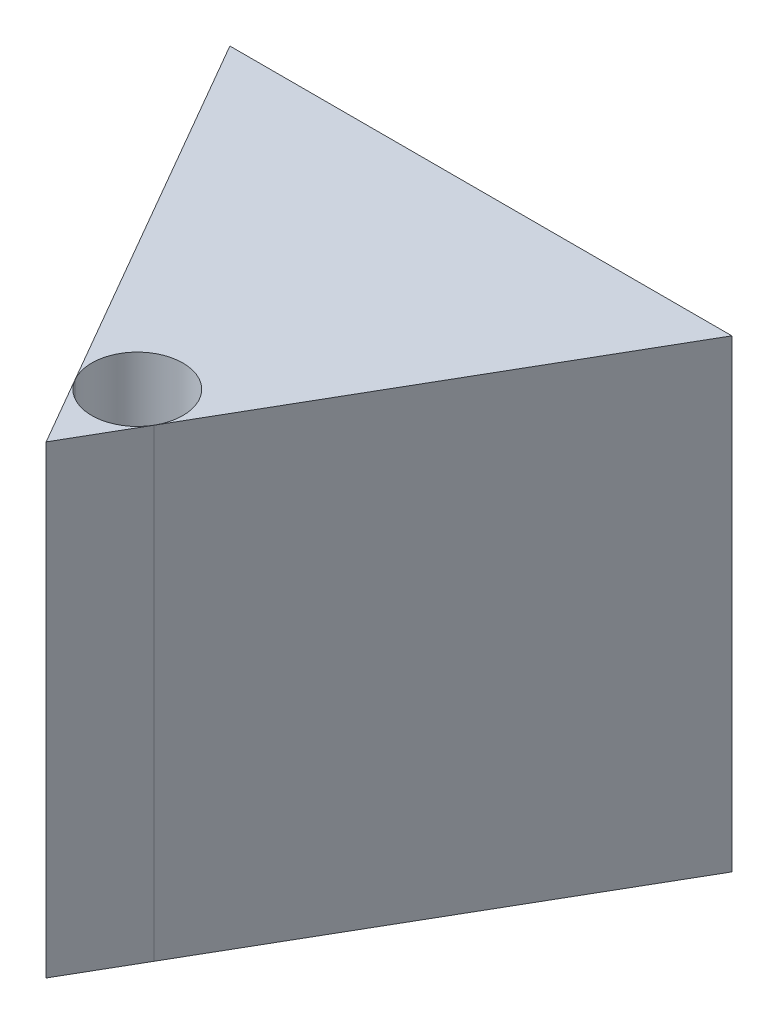
ISO-10303-21;
HEADER;
FILE_DESCRIPTION(('STEP AP214'),'2;1');
FILE_NAME('part.step','',(''),(''),'','','');
FILE_SCHEMA(('AUTOMOTIVE_DESIGN { 1 0 10303 214 1 1 1 1 }'));
ENDSEC;
DATA;
#1=APPLICATION_CONTEXT('core data for automotive mechanical design processes');
#2=APPLICATION_PROTOCOL_DEFINITION('international standard','automotive_design',2000,#1);
#3=PRODUCT_CONTEXT('',#1,'mechanical');
#4=PRODUCT('Part','Part','',(#3));
#5=PRODUCT_RELATED_PRODUCT_CATEGORY('part','',(#4));
#6=PRODUCT_DEFINITION_FORMATION('','',#4);
#7=PRODUCT_DEFINITION_CONTEXT('part definition',#1,'design');
#8=PRODUCT_DEFINITION('design','',#6,#7);
#9=PRODUCT_DEFINITION_SHAPE('','',#8);
#10=(LENGTH_UNIT() NAMED_UNIT(*) SI_UNIT(.MILLI.,.METRE.));
#11=(NAMED_UNIT(*) PLANE_ANGLE_UNIT() SI_UNIT($,.RADIAN.));
#12=(NAMED_UNIT(*) SI_UNIT($,.STERADIAN.) SOLID_ANGLE_UNIT());
#13=UNCERTAINTY_MEASURE_WITH_UNIT(LENGTH_MEASURE(1.E-05),#10,'distance_accuracy_value','');
#14=(GEOMETRIC_REPRESENTATION_CONTEXT(3) GLOBAL_UNCERTAINTY_ASSIGNED_CONTEXT((#13)) GLOBAL_UNIT_ASSIGNED_CONTEXT((#10,
#11,#12)) REPRESENTATION_CONTEXT('',''));
#15=CARTESIAN_POINT('',(0.,0.,0.));
#16=DIRECTION('',(0.,0.,1.));
#17=DIRECTION('',(1.,0.,0.));
#18=AXIS2_PLACEMENT_3D('',#15,#16,#17);
#19=CARTESIAN_POINT('',(-81.0882561747552,200.,46.8163265306122));
#20=DIRECTION('',(-0.866025403784439,0.,0.5));
#21=DIRECTION('',(0.5,0.,0.866025403784439));
#22=AXIS2_PLACEMENT_3D('',#19,#20,#21);
#23=PLANE('',#22);
#24=DIRECTION('',(-0.5,0.,-0.866025403784439));
#25=VECTOR('',#24,1.);
#26=CARTESIAN_POINT('',(-81.0882561747552,0.,46.8163265306122));
#27=LINE('',#26,#25);
#28=CARTESIAN_POINT('',(0.,0.,187.265306122449));
#29=VERTEX_POINT('',#28);
#30=CARTESIAN_POINT('',(-17.0023762947068,0.,157.816326530612));
#31=VERTEX_POINT('',#30);
#32=EDGE_CURVE('E85',#29,#31,#27,.T.);
#33=ORIENTED_EDGE('',*,*,#32,.F.);
#34=DIRECTION('',(0.,-1.,0.));
#35=VECTOR('',#34,1.);
#36=CARTESIAN_POINT('',(0.,200.,187.265306122449));
#37=LINE('',#36,#35);
#38=CARTESIAN_POINT('',(0.,200.,187.265306122449));
#39=VERTEX_POINT('',#38);
#40=EDGE_CURVE('E12',#39,#29,#37,.T.);
#41=ORIENTED_EDGE('',*,*,#40,.F.);
#42=DIRECTION('',(-0.5,0.,-0.866025403784439));
#43=VECTOR('',#42,1.);
#44=CARTESIAN_POINT('',(-81.0882561747552,200.,46.8163265306122));
#45=LINE('',#44,#43);
#46=CARTESIAN_POINT('',(-17.0023762947068,200.,157.816326530612));
#47=VERTEX_POINT('',#46);
#48=EDGE_CURVE('E83',#39,#47,#45,.T.);
#49=ORIENTED_EDGE('',*,*,#48,.T.);
#50=DIRECTION('',(0.,-1.,0.));
#51=VECTOR('',#50,1.);
#52=CARTESIAN_POINT('',(-17.0023762947068,200.,157.816326530612));
#53=LINE('',#52,#51);
#54=EDGE_CURVE('E67',#47,#31,#53,.T.);
#55=ORIENTED_EDGE('',*,*,#54,.T.);
#56=EDGE_LOOP('',(#33,#41,#49,#55));
#57=FACE_BOUND('',#56,.T.);
#58=ADVANCED_FACE('F51',(#57),#23,.T.);
#59=CARTESIAN_POINT('',(81.0882561747552,200.,46.8163265306123));
#60=DIRECTION('',(0.866025403784439,0.,0.5));
#61=DIRECTION('',(0.5,0.,-0.866025403784439));
#62=AXIS2_PLACEMENT_3D('',#59,#60,#61);
#63=PLANE('',#62);
#64=DIRECTION('',(-0.5,0.,0.866025403784439));
#65=VECTOR('',#64,1.);
#66=CARTESIAN_POINT('',(81.0882561747552,0.,46.8163265306123));
#67=LINE('',#66,#65);
#68=CARTESIAN_POINT('',(17.0023762947068,0.,157.816326530612));
#69=VERTEX_POINT('',#68);
#70=EDGE_CURVE('E101',#69,#29,#67,.T.);
#71=ORIENTED_EDGE('',*,*,#70,.F.);
#72=DIRECTION('',(0.,-1.,0.));
#73=VECTOR('',#72,1.);
#74=CARTESIAN_POINT('',(17.0023762947068,200.,157.816326530612));
#75=LINE('',#74,#73);
#76=CARTESIAN_POINT('',(17.0023762947068,200.,157.816326530612));
#77=VERTEX_POINT('',#76);
#78=EDGE_CURVE('E59',#77,#69,#75,.T.);
#79=ORIENTED_EDGE('',*,*,#78,.F.);
#80=DIRECTION('',(-0.5,0.,0.866025403784439));
#81=VECTOR('',#80,1.);
#82=CARTESIAN_POINT('',(81.0882561747552,200.,46.8163265306123));
#83=LINE('',#82,#81);
#84=EDGE_CURVE('E92',#77,#39,#83,.T.);
#85=ORIENTED_EDGE('',*,*,#84,.T.);
#86=ORIENTED_EDGE('',*,*,#40,.T.);
#87=EDGE_LOOP('',(#71,#79,#85,#86));
#88=FACE_BOUND('',#87,.T.);
#89=ADVANCED_FACE('F96',(#88),#63,.T.);
#90=CARTESIAN_POINT('',(0.,200.,148.));
#91=DIRECTION('',(0.,-1.,0.));
#92=DIRECTION('',(0.,0.,-1.));
#93=AXIS2_PLACEMENT_3D('',#90,#91,#92);
#94=CYLINDRICAL_SURFACE('',#93,19.6326530612245);
#95=CARTESIAN_POINT('',(0.,0.,148.));
#96=DIRECTION('',(0.,1.,0.));
#97=DIRECTION('',(0.,0.,1.));
#98=AXIS2_PLACEMENT_3D('',#95,#96,#97);
#99=CIRCLE('',#98,19.6326530612245);
#100=EDGE_CURVE('E94',#31,#69,#99,.T.);
#101=ORIENTED_EDGE('',*,*,#100,.F.);
#102=ORIENTED_EDGE('',*,*,#54,.F.);
#103=CARTESIAN_POINT('',(0.,200.,148.));
#104=DIRECTION('',(0.,1.,0.));
#105=DIRECTION('',(0.,0.,1.));
#106=AXIS2_PLACEMENT_3D('',#103,#104,#105);
#107=CIRCLE('',#106,19.6326530612245);
#108=EDGE_CURVE('E93',#47,#77,#107,.T.);
#109=ORIENTED_EDGE('',*,*,#108,.T.);
#110=ORIENTED_EDGE('',*,*,#78,.T.);
#111=EDGE_LOOP('',(#101,#102,#109,#110));
#112=FACE_BOUND('',#111,.T.);
#113=ADVANCED_FACE('F107',(#112),#94,.F.);
#114=CARTESIAN_POINT('',(0.,200.,0.));
#115=DIRECTION('',(0.,1.,0.));
#116=DIRECTION('',(0.,0.,1.));
#117=AXIS2_PLACEMENT_3D('',#114,#115,#116);
#118=PLANE('',#117);
#119=ORIENTED_EDGE('',*,*,#48,.F.);
#120=ORIENTED_EDGE('',*,*,#84,.F.);
#121=ORIENTED_EDGE('',*,*,#108,.F.);
#122=EDGE_LOOP('',(#119,#120,#121));
#123=FACE_BOUND('',#122,.T.);
#124=ADVANCED_FACE('F91',(#123),#118,.T.);
#125=CARTESIAN_POINT('',(0.,0.,0.));
#126=DIRECTION('',(0.,1.,0.));
#127=DIRECTION('',(0.,0.,1.));
#128=AXIS2_PLACEMENT_3D('',#125,#126,#127);
#129=PLANE('',#128);
#130=ORIENTED_EDGE('',*,*,#32,.T.);
#131=ORIENTED_EDGE('',*,*,#100,.T.);
#132=ORIENTED_EDGE('',*,*,#70,.T.);
#133=EDGE_LOOP('',(#130,#131,#132));
#134=FACE_BOUND('',#133,.T.);
#135=ADVANCED_FACE('F106',(#134),#129,.F.);
#136=CLOSED_SHELL('',(#58,#89,#113,#124,#135));
#137=MANIFOLD_SOLID_BREP('B2',#136);
#138=CARTESIAN_POINT('',(0.,200.,0.));
#139=DIRECTION('',(0.,0.,-1.));
#140=DIRECTION('',(-1.,0.,0.));
#141=AXIS2_PLACEMENT_3D('',#138,#139,#140);
#142=PLANE('',#141);
#143=DIRECTION('',(1.,0.,0.));
#144=VECTOR('',#143,1.);
#145=CARTESIAN_POINT('',(0.,0.,0.));
#146=LINE('',#145,#144);
#147=CARTESIAN_POINT('',(-108.117674899674,0.,0.));
#148=VERTEX_POINT('',#147);
#149=CARTESIAN_POINT('',(108.117674899674,0.,0.));
#150=VERTEX_POINT('',#149);
#151=EDGE_CURVE('E223',#148,#150,#146,.T.);
#152=ORIENTED_EDGE('',*,*,#151,.F.);
#153=DIRECTION('',(0.,-1.,0.));
#154=VECTOR('',#153,1.);
#155=CARTESIAN_POINT('',(-108.117674899674,200.,0.));
#156=LINE('',#155,#154);
#157=CARTESIAN_POINT('',(-108.117674899674,200.,0.));
#158=VERTEX_POINT('',#157);
#159=EDGE_CURVE('E49',#158,#148,#156,.T.);
#160=ORIENTED_EDGE('',*,*,#159,.F.);
#161=DIRECTION('',(1.,0.,0.));
#162=VECTOR('',#161,1.);
#163=CARTESIAN_POINT('',(0.,200.,0.));
#164=LINE('',#163,#162);
#165=CARTESIAN_POINT('',(108.117674899674,200.,0.));
#166=VERTEX_POINT('',#165);
#167=EDGE_CURVE('E212',#158,#166,#164,.T.);
#168=ORIENTED_EDGE('',*,*,#167,.T.);
#169=DIRECTION('',(0.,-1.,0.));
#170=VECTOR('',#169,1.);
#171=CARTESIAN_POINT('',(108.117674899674,200.,0.));
#172=LINE('',#171,#170);
#173=EDGE_CURVE('E172',#166,#150,#172,.T.);
#174=ORIENTED_EDGE('',*,*,#173,.T.);
#175=EDGE_LOOP('',(#152,#160,#168,#174));
#176=FACE_BOUND('',#175,.T.);
#177=ADVANCED_FACE('F155',(#176),#142,.T.);
#178=CARTESIAN_POINT('',(-81.0882561747552,200.,46.8163265306122));
#179=DIRECTION('',(-0.866025403784439,0.,0.5));
#180=DIRECTION('',(0.5,0.,0.866025403784439));
#181=AXIS2_PLACEMENT_3D('',#178,#179,#180);
#182=PLANE('',#181);
#183=DIRECTION('',(-0.5,0.,-0.866025403784439));
#184=VECTOR('',#183,1.);
#185=CARTESIAN_POINT('',(-81.0882561747552,0.,46.8163265306122));
#186=LINE('',#185,#184);
#187=CARTESIAN_POINT('',(-17.0023762947068,0.,157.816326530612));
#188=VERTEX_POINT('',#187);
#189=EDGE_CURVE('E202',#188,#148,#186,.T.);
#190=ORIENTED_EDGE('',*,*,#189,.F.);
#191=DIRECTION('',(0.,-1.,0.));
#192=VECTOR('',#191,1.);
#193=CARTESIAN_POINT('',(-17.0023762947068,200.,157.816326530612));
#194=LINE('',#193,#192);
#195=CARTESIAN_POINT('',(-17.0023762947068,200.,157.816326530612));
#196=VERTEX_POINT('',#195);
#197=EDGE_CURVE('E164',#196,#188,#194,.T.);
#198=ORIENTED_EDGE('',*,*,#197,.F.);
#199=DIRECTION('',(-0.5,0.,-0.866025403784439));
#200=VECTOR('',#199,1.);
#201=CARTESIAN_POINT('',(-81.0882561747552,200.,46.8163265306122));
#202=LINE('',#201,#200);
#203=EDGE_CURVE('E200',#196,#158,#202,.T.);
#204=ORIENTED_EDGE('',*,*,#203,.T.);
#205=ORIENTED_EDGE('',*,*,#159,.T.);
#206=EDGE_LOOP('',(#190,#198,#204,#205));
#207=FACE_BOUND('',#206,.T.);
#208=ADVANCED_FACE('F199',(#207),#182,.T.);
#209=CARTESIAN_POINT('',(0.,200.,148.));
#210=DIRECTION('',(0.,-1.,0.));
#211=DIRECTION('',(0.,0.,-1.));
#212=AXIS2_PLACEMENT_3D('',#209,#210,#211);
#213=CYLINDRICAL_SURFACE('',#212,19.6326530612245);
#214=CARTESIAN_POINT('',(0.,0.,148.));
#215=DIRECTION('',(0.,1.,0.));
#216=DIRECTION('',(0.,0.,1.));
#217=AXIS2_PLACEMENT_3D('',#214,#215,#216);
#218=CIRCLE('',#217,19.6326530612245);
#219=CARTESIAN_POINT('',(17.0023762947068,0.,157.816326530612));
#220=VERTEX_POINT('',#219);
#221=EDGE_CURVE('E228',#220,#188,#218,.T.);
#222=ORIENTED_EDGE('',*,*,#221,.F.);
#223=DIRECTION('',(0.,-1.,0.));
#224=VECTOR('',#223,1.);
#225=CARTESIAN_POINT('',(17.0023762947068,200.,157.816326530612));
#226=LINE('',#225,#224);
#227=CARTESIAN_POINT('',(17.0023762947068,200.,157.816326530612));
#228=VERTEX_POINT('',#227);
#229=EDGE_CURVE('E185',#228,#220,#226,.T.);
#230=ORIENTED_EDGE('',*,*,#229,.F.);
#231=CARTESIAN_POINT('',(0.,200.,148.));
#232=DIRECTION('',(0.,1.,0.));
#233=DIRECTION('',(0.,0.,1.));
#234=AXIS2_PLACEMENT_3D('',#231,#232,#233);
#235=CIRCLE('',#234,19.6326530612245);
#236=EDGE_CURVE('E211',#228,#196,#235,.T.);
#237=ORIENTED_EDGE('',*,*,#236,.T.);
#238=ORIENTED_EDGE('',*,*,#197,.T.);
#239=EDGE_LOOP('',(#222,#230,#237,#238));
#240=FACE_BOUND('',#239,.T.);
#241=ADVANCED_FACE('F215',(#240),#213,.F.);
#242=CARTESIAN_POINT('',(81.0882561747552,200.,46.8163265306123));
#243=DIRECTION('',(0.866025403784439,0.,0.5));
#244=DIRECTION('',(0.5,0.,-0.866025403784439));
#245=AXIS2_PLACEMENT_3D('',#242,#243,#244);
#246=PLANE('',#245);
#247=DIRECTION('',(-0.5,0.,0.866025403784439));
#248=VECTOR('',#247,1.);
#249=CARTESIAN_POINT('',(81.0882561747552,0.,46.8163265306123));
#250=LINE('',#249,#248);
#251=EDGE_CURVE('E231',#150,#220,#250,.T.);
#252=ORIENTED_EDGE('',*,*,#251,.F.);
#253=ORIENTED_EDGE('',*,*,#173,.F.);
#254=DIRECTION('',(-0.5,0.,0.866025403784439));
#255=VECTOR('',#254,1.);
#256=CARTESIAN_POINT('',(81.0882561747552,200.,46.8163265306123));
#257=LINE('',#256,#255);
#258=EDGE_CURVE('E217',#166,#228,#257,.T.);
#259=ORIENTED_EDGE('',*,*,#258,.T.);
#260=ORIENTED_EDGE('',*,*,#229,.T.);
#261=EDGE_LOOP('',(#252,#253,#259,#260));
#262=FACE_BOUND('',#261,.T.);
#263=ADVANCED_FACE('F240',(#262),#246,.T.);
#264=CARTESIAN_POINT('',(0.,200.,0.));
#265=DIRECTION('',(0.,1.,0.));
#266=DIRECTION('',(0.,0.,1.));
#267=AXIS2_PLACEMENT_3D('',#264,#265,#266);
#268=PLANE('',#267);
#269=ORIENTED_EDGE('',*,*,#167,.F.);
#270=ORIENTED_EDGE('',*,*,#203,.F.);
#271=ORIENTED_EDGE('',*,*,#236,.F.);
#272=ORIENTED_EDGE('',*,*,#258,.F.);
#273=EDGE_LOOP('',(#269,#270,#271,#272));
#274=FACE_BOUND('',#273,.T.);
#275=ADVANCED_FACE('F209',(#274),#268,.T.);
#276=CARTESIAN_POINT('',(0.,0.,0.));
#277=DIRECTION('',(0.,1.,0.));
#278=DIRECTION('',(0.,0.,1.));
#279=AXIS2_PLACEMENT_3D('',#276,#277,#278);
#280=PLANE('',#279);
#281=ORIENTED_EDGE('',*,*,#151,.T.);
#282=ORIENTED_EDGE('',*,*,#251,.T.);
#283=ORIENTED_EDGE('',*,*,#221,.T.);
#284=ORIENTED_EDGE('',*,*,#189,.T.);
#285=EDGE_LOOP('',(#281,#282,#283,#284));
#286=FACE_BOUND('',#285,.T.);
#287=ADVANCED_FACE('F247',(#286),#280,.F.);
#288=CLOSED_SHELL('',(#177,#208,#241,#263,#275,#287));
#289=MANIFOLD_SOLID_BREP('B6',#288);
#290=ADVANCED_BREP_SHAPE_REPRESENTATION('',(#18,#137,#289),#14);
#291=SHAPE_DEFINITION_REPRESENTATION(#9,#290);
ENDSEC;
END-ISO-10303-21;
